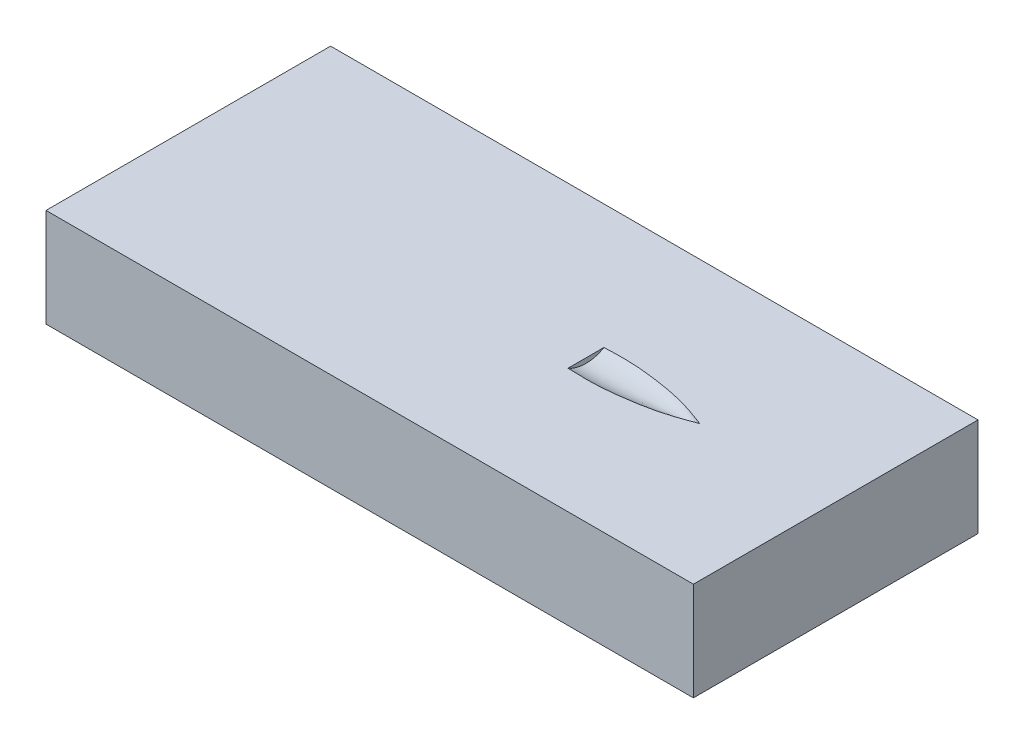
ISO-10303-21;
HEADER;
FILE_DESCRIPTION(('STEP AP214'),'2;1');
FILE_NAME('part.step','',(''),(''),'','','');
FILE_SCHEMA(('AUTOMOTIVE_DESIGN { 1 0 10303 214 1 1 1 1 }'));
ENDSEC;
DATA;
#1=APPLICATION_CONTEXT('core data for automotive mechanical design processes');
#2=APPLICATION_PROTOCOL_DEFINITION('international standard','automotive_design',2000,#1);
#3=PRODUCT_CONTEXT('',#1,'mechanical');
#4=PRODUCT('Part','Part','',(#3));
#5=PRODUCT_RELATED_PRODUCT_CATEGORY('part','',(#4));
#6=PRODUCT_DEFINITION_FORMATION('','',#4);
#7=PRODUCT_DEFINITION_CONTEXT('part definition',#1,'design');
#8=PRODUCT_DEFINITION('design','',#6,#7);
#9=PRODUCT_DEFINITION_SHAPE('','',#8);
#10=(LENGTH_UNIT() NAMED_UNIT(*) SI_UNIT(.MILLI.,.METRE.));
#11=(NAMED_UNIT(*) PLANE_ANGLE_UNIT() SI_UNIT($,.RADIAN.));
#12=(NAMED_UNIT(*) SI_UNIT($,.STERADIAN.) SOLID_ANGLE_UNIT());
#13=UNCERTAINTY_MEASURE_WITH_UNIT(LENGTH_MEASURE(1.E-05),#10,'distance_accuracy_value','');
#14=(GEOMETRIC_REPRESENTATION_CONTEXT(3) GLOBAL_UNCERTAINTY_ASSIGNED_CONTEXT((#13)) GLOBAL_UNIT_ASSIGNED_CONTEXT((#10,
#11,#12)) REPRESENTATION_CONTEXT('',''));
#15=CARTESIAN_POINT('',(0.,0.,0.));
#16=DIRECTION('',(0.,0.,1.));
#17=DIRECTION('',(1.,0.,0.));
#18=AXIS2_PLACEMENT_3D('',#15,#16,#17);
#19=CARTESIAN_POINT('',(-150.,-17.,81.405771285938));
#20=CARTESIAN_POINT('',(-116.638846737262,-17.6672118608523,80.8095738798847));
#21=CARTESIAN_POINT('',(-49.7427742053213,-19.0051108443265,79.6140736942468));
#22=CARTESIAN_POINT('',(50.6317027871444,-21.0127703181343,65.3499909791472));
#23=CARTESIAN_POINT('',(151.227954208533,-23.0240357792725,40.5691423295298));
#24=CARTESIAN_POINT('',(216.774855827415,-24.3366500190966,13.6494309993884));
#25=CARTESIAN_POINT('',(249.9,-25.,0.0451370225326122));
#26=CARTESIAN_POINT('',(-150.,-21.8051540860384,75.7963536954995));
#27=CARTESIAN_POINT('',(-116.638846737262,-22.5655101612967,75.3244737477681));
#28=CARTESIAN_POINT('',(-49.7427742053213,-24.0901827276193,74.3782560027998));
#29=CARTESIAN_POINT('',(50.6317027871444,-25.3526769380671,60.9130466986286));
#30=CARTESIAN_POINT('',(151.227954208533,-26.3707911350128,39.0705039634522));
#31=CARTESIAN_POINT('',(216.774855827415,-27.7472853242932,13.1463238474013));
#32=CARTESIAN_POINT('',(249.9,-28.4429180292189,0.0451370225326118));
#33=CARTESIAN_POINT('',(-150.,-30.4196988845977,63.7246782220816));
#34=CARTESIAN_POINT('',(-116.638846737262,-31.3659657699669,63.4502856806367));
#35=CARTESIAN_POINT('',(-49.7427742053213,-33.2634282977069,62.9000713876785));
#36=CARTESIAN_POINT('',(50.6317027871446,-33.106174464079,51.2985487065188));
#37=CARTESIAN_POINT('',(151.227954208533,-32.7893086977552,34.7857992726971));
#38=CARTESIAN_POINT('',(216.774855827415,-33.8681584780577,11.7060337279786));
#39=CARTESIAN_POINT('',(249.9,-34.4133719607769,0.0423159586243231));
#40=CARTESIAN_POINT('',(-150.,-39.9491696874336,43.6235895569039));
#41=CARTESIAN_POINT('',(-116.638846737262,-41.1292967625243,43.5175237114742));
#42=CARTESIAN_POINT('',(-49.7427742053211,-43.4956977616275,43.3048395625438));
#43=CARTESIAN_POINT('',(50.6317027871442,-41.6370640720175,35.1670631615842));
#44=CARTESIAN_POINT('',(151.227954208534,-40.5287833395358,25.1330207184538));
#45=CARTESIAN_POINT('',(216.774855827415,-40.6321518122783,8.45847664431594));
#46=CARTESIAN_POINT('',(249.9,-40.6843906744964,0.0317369689682422));
#47=CARTESIAN_POINT('',(-150.,-45.7889049113112,22.1583537592279));
#48=CARTESIAN_POINT('',(-116.638846737262,-47.1240890131779,22.1291663050477));
#49=CARTESIAN_POINT('',(-49.7427742053214,-49.8014117009921,22.0706393699479));
#50=CARTESIAN_POINT('',(50.6317027871445,-46.8411508509107,17.8763287205671));
#51=CARTESIAN_POINT('',(151.227954208534,-45.5486295254136,13.1697217970133));
#52=CARTESIAN_POINT('',(216.774855827415,-44.7405878200843,4.43244489076427));
#53=CARTESIAN_POINT('',(249.9,-44.3322314016204,0.0169263834497292));
#54=CARTESIAN_POINT('',(-150.,-47.7559083208649,0.));
#55=CARTESIAN_POINT('',(-116.638846737262,-49.1459003431606,0.));
#56=CARTESIAN_POINT('',(-49.7427742053212,-51.9331243461798,0.));
#57=CARTESIAN_POINT('',(50.6317027871444,-48.5824626978723,0.));
#58=CARTESIAN_POINT('',(151.227954208533,-47.3149233158318,0.));
#59=CARTESIAN_POINT('',(216.774855827415,-46.0550665245405,0.));
#60=CARTESIAN_POINT('',(249.9,-45.4183783391708,0.));
#61=CARTESIAN_POINT('',(-150.,-45.7889049113112,-22.1583537592281));
#62=CARTESIAN_POINT('',(-116.638846737262,-47.1259260630216,-22.1291663050479));
#63=CARTESIAN_POINT('',(-49.7427742053212,-49.8069324190415,-22.0706393699482));
#64=CARTESIAN_POINT('',(50.631702787144,-46.8188095609941,-17.8763287205673));
#65=CARTESIAN_POINT('',(151.227954208535,-45.6344294759758,-13.1697217970134));
#66=CARTESIAN_POINT('',(216.774855827415,-44.5515603869442,-4.43244489076432));
#67=CARTESIAN_POINT('',(249.9,-44.0043156841697,-0.0169263834497295));
#68=CARTESIAN_POINT('',(-150.,-39.9491696874333,-43.6235895569039));
#69=CARTESIAN_POINT('',(-116.638846737262,-41.13228196852,-43.5175237114741));
#70=CARTESIAN_POINT('',(-49.7427742053215,-43.5046689284581,-43.3048395625436));
#71=CARTESIAN_POINT('',(50.6317027871449,-41.6007594759027,-35.1670631615843));
#72=CARTESIAN_POINT('',(151.227954208532,-40.6682082591992,-25.1330207184536));
#73=CARTESIAN_POINT('',(216.774855827415,-40.3249822334255,-8.45847664431589));
#74=CARTESIAN_POINT('',(249.9,-40.1515276336391,-0.0317369689682436));
#75=CARTESIAN_POINT('',(-150.,-30.4196988845977,-63.7246782220818));
#76=CARTESIAN_POINT('',(-116.638846737262,-31.3687213447323,-63.4502856806368));
#77=CARTESIAN_POINT('',(-49.7427742053211,-33.2717093747809,-62.9000713876787));
#78=CARTESIAN_POINT('',(50.631702787144,-33.072662529204,-51.298548706519));
#79=CARTESIAN_POINT('',(151.227954208534,-32.9180086235985,-34.7857992726972));
#80=CARTESIAN_POINT('',(216.774855827415,-33.5846173283475,-11.7060337279786));
#81=CARTESIAN_POINT('',(249.9,-33.921498384601,-0.0423159586243264));
#82=CARTESIAN_POINT('',(-150.,-21.8051540860384,-75.7963536954995));
#83=CARTESIAN_POINT('',(-116.638846737262,-22.5667348611924,-75.3244737477681));
#84=CARTESIAN_POINT('',(-49.7427742053213,-24.0938632063189,-74.3782560027999));
#85=CARTESIAN_POINT('',(50.6317027871444,-25.3377827447892,-60.9130466986286));
#86=CARTESIAN_POINT('',(151.227954208533,-26.4279911020543,-39.0705039634522));
#87=CARTESIAN_POINT('',(216.774855827415,-27.6212670355331,-13.1463238474013));
#88=CARTESIAN_POINT('',(249.9,-28.2243075509185,-0.0451370225326169));
#89=CARTESIAN_POINT('',(-150.,-17.,-81.405771285938));
#90=CARTESIAN_POINT('',(-116.638846737262,-17.6672118608522,-80.8095738798847));
#91=CARTESIAN_POINT('',(-49.7427742053213,-19.0051108443264,-79.614073694247));
#92=CARTESIAN_POINT('',(50.6317027871444,-21.0127703181342,-65.3499909791472));
#93=CARTESIAN_POINT('',(151.227954208533,-23.0240357792725,-40.5691423295299));
#94=CARTESIAN_POINT('',(216.774855827415,-24.3366500190966,-13.6494309993884));
#95=CARTESIAN_POINT('',(249.9,-25.,-0.0451370225326184));
#96=B_SPLINE_SURFACE_WITH_KNOTS('',3,3,((#19,#20,#21,#22,#23,#24,#25),(#26,#27,#28,#29,#30,#31,
#32),(#33,#34,#35,#36,#37,#38,#39),(#40,#41,#42,#43,#44,#45,#46),(#47,#48,#49,#50,#51,#52,#53),
(#54,#55,#56,#57,#58,#59,#60),(#61,#62,#63,#64,#65,#66,#67),(#68,#69,#70,#71,#72,#73,#74),(#75,
#76,#77,#78,#79,#80,#81),(#82,#83,#84,#85,#86,#87,#88),(#89,#90,#91,#92,#93,#94,#95)),
.UNSPECIFIED.,.F.,.F.,.F.,(4,1,1,1,1,1,1,1,4),(4,1,1,1,4),(0.,0.125,0.25,0.375,0.5,0.625,0.75,
0.875,1.),(0.,0.246022042488694,0.493325523526259,0.743944188554489,1.),.UNSPECIFIED.);
#97=CARTESIAN_POINT('',(-150.,78.0310764729347,0.));
#98=DIRECTION('',(1.,0.,0.));
#99=DIRECTION('',(0.,0.,1.));
#100=AXIS2_PLACEMENT_3D('',#97,#98,#99);
#101=CIRCLE('',#100,125.131151574111);
#102=CARTESIAN_POINT('',(-150.,-30.000000000094,63.1438135401164));
#103=VERTEX_POINT('',#102);
#104=CARTESIAN_POINT('',(-150.,-29.9999999999909,-63.1438135404537));
#105=VERTEX_POINT('',#104);
#106=EDGE_CURVE('E171',#103,#105,#101,.T.);
#107=CARTESIAN_POINT('',(-150.,-30.000000000094,63.1438135401164));
#108=CARTESIAN_POINT('',(-148.303174488047,-30.0000000000338,63.2109087051731));
#109=CARTESIAN_POINT('',(-146.606322308969,-30.000000000009,63.277348864486));
#110=CARTESIAN_POINT('',(-143.212498847984,-29.999999999991,63.4082834233983));
#111=CARTESIAN_POINT('',(-141.515527564128,-29.9999999999976,63.4727777723948));
#112=CARTESIAN_POINT('',(-138.121462040788,-30.0000000000024,63.5991823874871));
#113=CARTESIAN_POINT('',(-136.424367799808,-30.0000000000006,63.6610926135786));
#114=CARTESIAN_POINT('',(-133.030053619916,-29.9999999999993,63.7817049716669));
#115=CARTESIAN_POINT('',(-131.332833680239,-29.9999999999998,63.8404070822541));
#116=CARTESIAN_POINT('',(-127.93826552419,-30.0000000000002,63.9539883800537));
#117=CARTESIAN_POINT('',(-126.240917307825,-30.,64.0088675674974));
#118=CARTESIAN_POINT('',(-122.846090393193,-30.,64.1141974889702));
#119=CARTESIAN_POINT('',(-121.14861169553,-30.,64.1646482423859));
#120=CARTESIAN_POINT('',(-117.753433092101,-30.,64.260526299464));
#121=CARTESIAN_POINT('',(-116.055733179729,-30.,64.3059533701372));
#122=CARTESIAN_POINT('',(-112.660197008215,-30.,64.3911906408751));
#123=CARTESIAN_POINT('',(-110.962360749514,-30.,64.4310008584292));
#124=CARTESIAN_POINT('',(-107.566547651452,-30.,64.5044202100621));
#125=CARTESIAN_POINT('',(-105.868570811633,-30.,64.538029323094));
#126=CARTESIAN_POINT('',(-102.472472627765,-30.,64.5984675228034));
#127=CARTESIAN_POINT('',(-100.774351282057,-30.,64.6252965168175));
#128=CARTESIAN_POINT('',(-97.3779594205936,-30.,64.6715998564886));
#129=CARTESIAN_POINT('',(-95.6796889019914,-30.,64.6910739961439));
#130=CARTESIAN_POINT('',(-92.2829971369807,-30.,64.722096698709));
#131=CARTESIAN_POINT('',(-90.5845758872372,-30.,64.7336448912877));
#132=CARTESIAN_POINT('',(-85.4777005511371,-30.,64.7555965747348));
#133=CARTESIAN_POINT('',(-82.0691790534721,-30.,64.7531418645007));
#134=CARTESIAN_POINT('',(-75.2521151613664,-30.,64.7094654784167));
#135=CARTESIAN_POINT('',(-71.8435727831338,-30.,64.6682410078079));
#136=CARTESIAN_POINT('',(-66.7313803213126,-30.,64.573938876537));
#137=CARTESIAN_POINT('',(-65.0274220727421,-30.,64.5370940029457));
#138=CARTESIAN_POINT('',(-61.619786899533,-30.,64.4520211481255));
#139=CARTESIAN_POINT('',(-59.9161099749199,-30.,64.4037931658663));
#140=CARTESIAN_POINT('',(-56.5091960956182,-30.,64.2953931343788));
#141=CARTESIAN_POINT('',(-54.8059591270966,-30.,64.2352215228313));
#142=CARTESIAN_POINT('',(-52.2514721688442,-30.,64.1355927523358));
#143=CARTESIAN_POINT('',(-51.4000375501818,-30.,64.1008212522839));
#144=CARTESIAN_POINT('',(-49.6973052302404,-30.,64.0280738154914));
#145=CARTESIAN_POINT('',(-48.8460075289687,-30.,63.9900978785816));
#146=CARTESIAN_POINT('',(-46.2923815641978,-30.,63.8714199545743));
#147=CARTESIAN_POINT('',(-44.5902716752403,-30.,63.7859659515517));
#148=CARTESIAN_POINT('',(-41.1867126235601,-30.,63.6028465417992));
#149=CARTESIAN_POINT('',(-39.4852634615501,-30.,63.5051811219336));
#150=CARTESIAN_POINT('',(-34.3821298354002,-30.,63.1945195524769));
#151=CARTESIAN_POINT('',(-30.981507247715,-30.,62.9638509521825));
#152=CARTESIAN_POINT('',(-24.1835172351267,-30.,62.4586964195533));
#153=CARTESIAN_POINT('',(-20.7861498378634,-30.,62.1842101184237));
#154=CARTESIAN_POINT('',(-13.9947932701885,-30.,61.5945509679733));
#155=CARTESIAN_POINT('',(-10.6008042682078,-30.,61.2793761833686));
#156=CARTESIAN_POINT('',(-3.81632360834457,-30.,60.6113582098535));
#157=CARTESIAN_POINT('',(-0.425832193290021,-30.,60.2585125627398));
#158=CARTESIAN_POINT('',(6.35153114557136,-30.,59.5180860243212));
#159=CARTESIAN_POINT('',(9.73840286456164,-30.,59.1305032628925));
#160=CARTESIAN_POINT('',(16.5083946786765,-30.,58.3234722531869));
#161=CARTESIAN_POINT('',(19.8915147109152,-30.,57.9040234787241));
#162=CARTESIAN_POINT('',(26.6538703401469,-30.,57.036077348936));
#163=CARTESIAN_POINT('',(30.0331061013356,-30.,56.5875812711835));
#164=CARTESIAN_POINT('',(35.4304408887764,-30.,55.8498060895503));
#165=CARTESIAN_POINT('',(37.4497022512696,-30.,55.5689881368893));
#166=CARTESIAN_POINT('',(41.4868479699227,-30.,54.9985166756687));
#167=CARTESIAN_POINT('',(43.5047324048297,-30.,54.7088637249445));
#168=CARTESIAN_POINT('',(46.5306102530659,-30.,54.2681598203254));
#169=CARTESIAN_POINT('',(47.5390586802216,-30.,54.1202240110798));
#170=CARTESIAN_POINT('',(49.5556611062366,-30.,53.8223589800068));
#171=CARTESIAN_POINT('',(50.5638151050935,-30.,53.672429758163));
#172=CARTESIAN_POINT('',(53.5877908081136,-30.,53.2196346994404));
#173=CARTESIAN_POINT('',(55.6031624935621,-30.,52.913756185464));
#174=CARTESIAN_POINT('',(59.6325741740228,-30.,52.2932666218014));
#175=CARTESIAN_POINT('',(61.6466141608582,-30.,51.9786555189959));
#176=CARTESIAN_POINT('',(65.6729067879237,-30.,51.3400965315165));
#177=CARTESIAN_POINT('',(67.6851596498867,-30.,51.0161500460558));
#178=CARTESIAN_POINT('',(71.7080514048187,-30.,50.358196349437));
#179=CARTESIAN_POINT('',(73.7186902736374,-30.,50.0241889905155));
#180=CARTESIAN_POINT('',(77.7381668563762,-30.,49.3454363570875));
#181=CARTESIAN_POINT('',(79.7470045608019,-30.,49.0006910263164));
#182=CARTESIAN_POINT('',(83.7626893900216,-30.,48.2997723911528));
#183=CARTESIAN_POINT('',(85.7695365121799,-30.,47.9435990716493));
#184=CARTESIAN_POINT('',(89.7810485265083,-30.,47.2191213481386));
#185=CARTESIAN_POINT('',(91.7857134111312,-30.,46.8508169023133));
#186=CARTESIAN_POINT('',(95.7941160974211,-30.,46.1010881665573));
#187=CARTESIAN_POINT('',(97.7978521325725,-30.,45.719654425564));
#188=CARTESIAN_POINT('',(101.802697049571,-30.,44.9431945431398));
#189=CARTESIAN_POINT('',(103.803805923334,-30.,44.5481683599839));
#190=CARTESIAN_POINT('',(107.803145334671,-30.,43.7437839979624));
#191=CARTESIAN_POINT('',(109.801375868994,-30.,43.3344258029281));
#192=CARTESIAN_POINT('',(113.794704394706,-30.,42.5006229113007));
#193=CARTESIAN_POINT('',(115.789802362787,-30.,42.0761781030077));
#194=CARTESIAN_POINT('',(119.776608410611,-30.,41.2114327356625));
#195=CARTESIAN_POINT('',(121.768316412801,-30.,40.7711318188397));
#196=CARTESIAN_POINT('',(125.748045075474,-30.,39.8738991782947));
#197=CARTESIAN_POINT('',(127.736065629517,-30.,39.4169669821186));
#198=CARTESIAN_POINT('',(131.708046624629,-30.,38.4857018283268));
#199=CARTESIAN_POINT('',(133.692007030315,-30.,38.0113687197462));
#200=CARTESIAN_POINT('',(137.655456690163,-30.,37.0445335916654));
#201=CARTESIAN_POINT('',(139.634946040606,-30.,36.5520319674526));
#202=CARTESIAN_POINT('',(142.600524170553,-30.,35.7990712610573));
#203=CARTESIAN_POINT('',(143.588422377687,-30.,35.5457212057149));
#204=CARTESIAN_POINT('',(145.562966713574,-30.,35.0341859320255));
#205=CARTESIAN_POINT('',(146.549612842859,-30.,34.7760007157349));
#206=CARTESIAN_POINT('',(148.521551720992,-30.,34.2547036606292));
#207=CARTESIAN_POINT('',(149.506844533085,-30.,33.991592061074));
#208=CARTESIAN_POINT('',(151.476080145986,-30.,33.4603625329659));
#209=CARTESIAN_POINT('',(152.460022945557,-30.,33.1922445998249));
#210=CARTESIAN_POINT('',(154.807480775352,-30.,32.5463276675969));
#211=CARTESIAN_POINT('',(156.17037665555,-30.,32.166276138256));
#212=CARTESIAN_POINT('',(158.893608246793,-30.,31.3971121746864));
#213=CARTESIAN_POINT('',(160.253943953489,-30.,31.0079997250848));
#214=CARTESIAN_POINT('',(164.331242264044,-30.,29.8275319124085));
#215=CARTESIAN_POINT('',(167.044419595573,-30.,29.0230671615297));
#216=CARTESIAN_POINT('',(172.461221488424,-30.,27.3817146686648));
#217=CARTESIAN_POINT('',(175.164845076496,-30.,26.5448237216978));
#218=CARTESIAN_POINT('',(180.563059597437,-30.,24.8412124982684));
#219=CARTESIAN_POINT('',(183.257649301219,-30.,23.9744883303101));
#220=CARTESIAN_POINT('',(188.638316276971,-30.,22.2138575544842));
#221=CARTESIAN_POINT('',(191.324392380644,-30.,21.3199473803461));
#222=CARTESIAN_POINT('',(196.688572656636,-30.,19.5076415764406));
#223=CARTESIAN_POINT('',(199.366675975254,-30.,18.589243422487));
#224=CARTESIAN_POINT('',(204.718629963381,-30.,16.7296099147426));
#225=CARTESIAN_POINT('',(207.392471335761,-30.,15.7883478328095));
#226=CARTESIAN_POINT('',(212.733287523653,-30.,13.8868419438205));
#227=CARTESIAN_POINT('',(215.40026256722,-30.,12.9265987766295));
#228=CARTESIAN_POINT('',(220.727936241924,-30.,10.9899796444893));
#229=CARTESIAN_POINT('',(223.38863566916,-30.,10.0136058672683));
#230=CARTESIAN_POINT('',(228.704363037846,-30.,8.04761288768313));
#231=CARTESIAN_POINT('',(231.359392248565,-30.,7.05799711382233));
#232=CARTESIAN_POINT('',(236.664393540274,-30.,5.06843851848005));
#233=CARTESIAN_POINT('',(239.314367188139,-30.,4.06849986921668));
#234=CARTESIAN_POINT('',(244.609889430148,-30.,2.06124101394102));
#235=CARTESIAN_POINT('',(247.255439637464,-30.,1.05392506601491));
#236=CARTESIAN_POINT('',(249.9,-30.,0.0440428964813235));
#237=B_SPLINE_CURVE_WITH_KNOTS('',3,(#107,#108,#109,#110,#111,#112,#113,#114,#115,#116,#117,
#118,#119,#120,#121,#122,#123,#124,#125,#126,#127,#128,#129,#130,#131,#132,#133,#134,#135,#136,
#137,#138,#139,#140,#141,#142,#143,#144,#145,#146,#147,#148,#149,#150,#151,#152,#153,#154,#155,
#156,#157,#158,#159,#160,#161,#162,#163,#164,#165,#166,#167,#168,#169,#170,#171,#172,#173,#174,
#175,#176,#177,#178,#179,#180,#181,#182,#183,#184,#185,#186,#187,#188,#189,#190,#191,#192,#193,
#194,#195,#196,#197,#198,#199,#200,#201,#202,#203,#204,#205,#206,#207,#208,#209,#210,#211,#212,
#213,#214,#215,#216,#217,#218,#219,#220,#221,#222,#223,#224,#225,#226,#227,#228,#229,#230,#231,
#232,#233,#234,#235,#236),.UNSPECIFIED.,.F.,.F.,(4,2,2,2,2,2,2,2,2,2,2,2,2,2,2,2,2,2,2,2,2,2,2,
2,2,2,2,2,2,2,2,2,2,2,2,2,2,2,2,2,2,2,2,2,2,2,2,2,2,2,2,2,2,2,2,2,2,2,2,2,2,2,2,2,4),(0.,
5.09445560444609,10.1890435814435,15.2837103972693,20.3784112086652,25.4731117118842,
30.5677899108129,35.6627042927385,40.7576028100066,45.8525186192425,50.9475040565552,
56.0426321884293,61.1379983683537,71.3633653164922,81.58946942743,86.7025071503557,
91.8155453361055,96.9283961863908,99.4848239039344,102.041251756476,107.153961060412,
112.266675864075,122.491649058579,132.716708316855,142.942254093364,153.168467543795,
163.395231868606,173.622165099063,183.84864882859,189.9647151615,196.080396126545,
199.138118981614,202.195841862067,208.311177650781,214.426550646513,220.541011771961,
226.655562743916,232.770145760201,238.884736862046,244.999349044169,251.118458842121,
257.237587425712,263.356722912813,269.475903714851,275.595222674152,281.714715604216,
287.83426163765,293.953674608226,297.01326616608,300.072856422672,303.132298467457,
306.191743316262,310.43638926004,314.681042405936,323.17058662244,331.660972090382,
340.152469287148,348.645085247693,357.1385800253,365.642533289389,374.146200366831,
382.648723443779,391.149086153615,399.646138203348,408.138621469009),.UNSPECIFIED.);
#238=CARTESIAN_POINT('',(249.9,-29.9999999948522,0.0440754122912198));
#239=VERTEX_POINT('',#238);
#240=EDGE_CURVE('E298',#103,#239,#237,.T.);
#241=CARTESIAN_POINT('',(249.9,-25.,0.0451370225326122));
#242=CARTESIAN_POINT('',(249.9,-28.4429180292189,0.0451370225326118));
#243=CARTESIAN_POINT('',(249.9,-34.4133719607769,0.0423159586243231));
#244=CARTESIAN_POINT('',(249.9,-40.6843906744964,0.0317369689682422));
#245=CARTESIAN_POINT('',(249.9,-44.3322314016204,0.0169263834497292));
#246=CARTESIAN_POINT('',(249.9,-45.4183783391708,0.));
#247=CARTESIAN_POINT('',(249.9,-44.0043156841697,-0.0169263834497295));
#248=CARTESIAN_POINT('',(249.9,-40.1515276336391,-0.0317369689682436));
#249=CARTESIAN_POINT('',(249.9,-33.921498384601,-0.0423159586243264));
#250=CARTESIAN_POINT('',(249.9,-28.2243075509185,-0.0451370225326169));
#251=CARTESIAN_POINT('',(249.9,-25.,-0.0451370225326184));
#252=B_SPLINE_CURVE_WITH_KNOTS('',3,(#241,#242,#243,#244,#245,#246,#247,#248,#249,#250,#251),
.UNSPECIFIED.,.F.,.F.,(4,1,1,1,1,1,1,1,4),(0.,0.125,0.25,0.375,0.5,0.625,0.75,0.875,1.),.UNSPECIFIED.);
#253=CARTESIAN_POINT('',(249.9,-29.9999999930648,-0.0439430814385722));
#254=VERTEX_POINT('',#253);
#255=EDGE_CURVE('E250',#239,#254,#252,.T.);
#256=CARTESIAN_POINT('',(249.9,-30.0000000000039,-0.0439039966229397));
#257=CARTESIAN_POINT('',(248.525003905595,-30.0000000000014,-0.566016888253522));
#258=CARTESIAN_POINT('',(247.149781355388,-30.0000000000004,-1.08753477787595));
#259=CARTESIAN_POINT('',(244.39874255809,-29.9999999999996,-2.12900047401064));
#260=CARTESIAN_POINT('',(243.022926311229,-29.9999999999999,-2.6489482811317));
#261=CARTESIAN_POINT('',(240.270559768479,-30.0000000000001,-3.68689357328367));
#262=CARTESIAN_POINT('',(238.894009473392,-30.,-4.20489106043884));
#263=CARTESIAN_POINT('',(236.139379192437,-30.,-5.23880195783158));
#264=CARTESIAN_POINT('',(234.761298790403,-30.,-5.75471425954916));
#265=CARTESIAN_POINT('',(232.004123088798,-30.,-6.78382636157928));
#266=CARTESIAN_POINT('',(230.625027787873,-30.,-7.29702615826424));
#267=CARTESIAN_POINT('',(227.865682586439,-30.,-8.32033334653465));
#268=CARTESIAN_POINT('',(226.485432680283,-30.,-8.83044072288993));
#269=CARTESIAN_POINT('',(223.032595316343,-30.,-10.1015879910296));
#270=CARTESIAN_POINT('',(220.959206162864,-30.,-10.8604525372619));
#271=CARTESIAN_POINT('',(216.809104001261,-30.,-12.3690608327822));
#272=CARTESIAN_POINT('',(214.732390983892,-30.,-13.118804556653));
#273=CARTESIAN_POINT('',(210.575235498536,-30.,-14.6078671272578));
#274=CARTESIAN_POINT('',(208.494793041981,-30.,-15.3471860058827));
#275=CARTESIAN_POINT('',(204.3297740137,-30.,-16.8140958865783));
#276=CARTESIAN_POINT('',(202.245197440376,-30.,-17.5416868841134));
#277=CARTESIAN_POINT('',(198.0724623665,-30.,-18.9835083680896));
#278=CARTESIAN_POINT('',(195.984305868316,-30.,-19.6977446456116));
#279=CARTESIAN_POINT('',(191.80312755306,-30.,-21.1118746062777));
#280=CARTESIAN_POINT('',(189.710105712348,-30.,-21.811768219567));
#281=CARTESIAN_POINT('',(185.518852866269,-30.,-23.1958946923459));
#282=CARTESIAN_POINT('',(183.420621787012,-30.,-23.8801273282702));
#283=CARTESIAN_POINT('',(179.218610265836,-30.,-25.2316137053305));
#284=CARTESIAN_POINT('',(177.114829618895,-30.,-25.8988668092012));
#285=CARTESIAN_POINT('',(172.190829235871,-30.,-27.4370410009175));
#286=CARTESIAN_POINT('',(169.368345573389,-30.,-28.3007306257715));
#287=CARTESIAN_POINT('',(163.712380502053,-30.,-29.992136667254));
#288=CARTESIAN_POINT('',(160.87889833194,-30.,-30.8198505436633));
#289=CARTESIAN_POINT('',(156.62028111908,-30.,-32.0319704494908));
#290=CARTESIAN_POINT('',(155.199328072636,-30.,-32.4311059745819));
#291=CARTESIAN_POINT('',(152.354585419883,-30.,-33.2191353354822));
#292=CARTESIAN_POINT('',(150.930795815755,-30.,-33.6080291791656));
#293=CARTESIAN_POINT('',(146.655158472134,-30.,-34.7588432522044));
#294=CARTESIAN_POINT('',(143.799026383986,-30.,-35.504900533718));
#295=CARTESIAN_POINT('',(138.076659476911,-30.,-36.9569840842948));
#296=CARTESIAN_POINT('',(135.210424756159,-30.,-37.6630107412317));
#297=CARTESIAN_POINT('',(129.469066999094,-30.,-39.0372307378007));
#298=CARTESIAN_POINT('',(126.593944439293,-30.,-39.7054260698549));
#299=CARTESIAN_POINT('',(120.832557546992,-30.,-41.0070267027425));
#300=CARTESIAN_POINT('',(117.946284493925,-30.,-41.6403933482423));
#301=CARTESIAN_POINT('',(112.16664184067,-30.,-42.8738695887667));
#302=CARTESIAN_POINT('',(109.273272220996,-30.,-43.4739790923716));
#303=CARTESIAN_POINT('',(103.480195344557,-30.,-44.6432866912031));
#304=CARTESIAN_POINT('',(100.580487866048,-30.,-45.2124836862861));
#305=CARTESIAN_POINT('',(94.7754897149422,-30.,-46.3222904418708));
#306=CARTESIAN_POINT('',(91.870198813586,-30.,-46.862899004034));
#307=CARTESIAN_POINT('',(86.0547834394392,-30.,-47.9178302561482));
#308=CARTESIAN_POINT('',(83.1446588520983,-30.,-48.4321523137051));
#309=CARTESIAN_POINT('',(77.3203234888844,-30.,-49.4367892824901));
#310=CARTESIAN_POINT('',(74.4061127776338,-30.,-49.9271045690788));
#311=CARTESIAN_POINT('',(68.1935650634764,-30.,-50.948590531326));
#312=CARTESIAN_POINT('',(64.8947317788405,-30.,-51.4767420735728));
#313=CARTESIAN_POINT('',(59.9437217914089,-30.,-52.2506021982707));
#314=CARTESIAN_POINT('',(58.292971363065,-30.,-52.505487497677));
#315=CARTESIAN_POINT('',(54.9905950993985,-30.,-53.0095302393482));
#316=CARTESIAN_POINT('',(53.3389692638509,-30.,-53.2586876801405));
#317=CARTESIAN_POINT('',(50.0349552835981,-30.,-53.7517520453726));
#318=CARTESIAN_POINT('',(48.3825671484476,-30.,-53.9956590338882));
#319=CARTESIAN_POINT('',(45.077013576005,-30.,-54.4781473147619));
#320=CARTESIAN_POINT('',(43.4238481388958,-30.,-54.716728608373));
#321=CARTESIAN_POINT('',(40.1166662350948,-30.,-55.1882124839506));
#322=CARTESIAN_POINT('',(38.4626497488052,-30.,-55.4211149285671));
#323=CARTESIAN_POINT('',(35.1537857994906,-30.,-55.8809343515646));
#324=CARTESIAN_POINT('',(33.4989383364633,-30.,-56.1078513299304));
#325=CARTESIAN_POINT('',(28.5328768809106,-30.,-56.7791726304867));
#326=CARTESIAN_POINT('',(25.2203764671111,-30.,-57.2141140612297));
#327=CARTESIAN_POINT('',(18.5947272930632,-30.,-58.0557718376539));
#328=CARTESIAN_POINT('',(15.2815816254934,-30.,-58.4625125014017));
#329=CARTESIAN_POINT('',(8.65165552198158,-30.,-59.2454928249023));
#330=CARTESIAN_POINT('',(5.3348750610144,-30.,-59.621732273303));
#331=CARTESIAN_POINT('',(-1.30210586656756,-30.,-60.3409215242471));
#332=CARTESIAN_POINT('',(-4.6223061221263,-30.,-60.6838732697592));
#333=CARTESIAN_POINT('',(-11.2659212119177,-30.,-61.3336401098729));
#334=CARTESIAN_POINT('',(-14.5893356962466,-30.,-61.6404587704356));
#335=CARTESIAN_POINT('',(-21.239174895461,-30.,-62.2150363711028));
#336=CARTESIAN_POINT('',(-24.5655992348615,-30.,-62.482799647235));
#337=CARTESIAN_POINT('',(-31.2739618877537,-30.,-62.9801520170514));
#338=CARTESIAN_POINT('',(-34.6559500983379,-30.,-63.2090741205794));
#339=CARTESIAN_POINT('',(-39.731093432748,-30.,-63.5174013021972));
#340=CARTESIAN_POINT('',(-41.4231974917082,-30.,-63.6143357479775));
#341=CARTESIAN_POINT('',(-44.808060071684,-30.,-63.7960847979629));
#342=CARTESIAN_POINT('',(-46.5008185919772,-30.,-63.8808994155075));
#343=CARTESIAN_POINT('',(-49.0404538569022,-30.,-63.9986802452971));
#344=CARTESIAN_POINT('',(-49.8871140701547,-30.,-64.0363682596446));
#345=CARTESIAN_POINT('',(-51.5805699321534,-30.,-64.1085679675403));
#346=CARTESIAN_POINT('',(-52.4273655808941,-30.,-64.1430796612179));
#347=CARTESIAN_POINT('',(-54.967933615967,-30.,-64.2419722211293));
#348=CARTESIAN_POINT('',(-56.6618885663371,-30.,-64.3017106344661));
#349=CARTESIAN_POINT('',(-60.0504115693031,-30.,-64.4093562968381));
#350=CARTESIAN_POINT('',(-61.7449796747166,-30.,-64.4572618723058));
#351=CARTESIAN_POINT('',(-65.1343944706653,-30.,-64.541786694431));
#352=CARTESIAN_POINT('',(-66.829241161189,-30.,-64.5784059415537));
#353=CARTESIAN_POINT('',(-71.9146465569205,-30.,-64.672174929291));
#354=CARTESIAN_POINT('',(-75.3055116213773,-30.,-64.7132185259106));
#355=CARTESIAN_POINT('',(-82.087962783941,-30.,-64.7568214427822));
#356=CARTESIAN_POINT('',(-85.4795489144517,-30.,-64.759375061611));
#357=CARTESIAN_POINT('',(-92.2699562204608,-30.,-64.7304467836814));
#358=CARTESIAN_POINT('',(-95.6687770539562,-30.,-64.6988906943753));
#359=CARTESIAN_POINT('',(-102.465986947028,-30.,-64.6061972679687));
#360=CARTESIAN_POINT('',(-105.864376008349,-30.,-64.545060054407));
#361=CARTESIAN_POINT('',(-112.660214324403,-30.,-64.3978473891579));
#362=CARTESIAN_POINT('',(-116.057663642141,-30.0000000000001,-64.3117747860953));
#363=CARTESIAN_POINT('',(-122.851116656198,-29.9999999999999,-64.1194363559251));
#364=CARTESIAN_POINT('',(-126.247120500403,-29.9999999999998,-64.0131756715953));
#365=CARTESIAN_POINT('',(-133.03717663755,-30.0000000000002,-63.7853154223741));
#366=CARTESIAN_POINT('',(-136.43122915122,-30.0000000000009,-63.6637223163256));
#367=CARTESIAN_POINT('',(-143.216894924073,-29.9999999999991,-63.4102459076328));
#368=CARTESIAN_POINT('',(-146.608508416077,-29.9999999999967,-63.2783688789415));
#369=CARTESIAN_POINT('',(-150.,-29.9999999999909,-63.1438135404537));
#370=B_SPLINE_CURVE_WITH_KNOTS('',3,(#256,#257,#258,#259,#260,#261,#262,#263,#264,#265,#266,
#267,#268,#269,#270,#271,#272,#273,#274,#275,#276,#277,#278,#279,#280,#281,#282,#283,#284,#285,
#286,#287,#288,#289,#290,#291,#292,#293,#294,#295,#296,#297,#298,#299,#300,#301,#302,#303,#304,
#305,#306,#307,#308,#309,#310,#311,#312,#313,#314,#315,#316,#317,#318,#319,#320,#321,#322,#323,
#324,#325,#326,#327,#328,#329,#330,#331,#332,#333,#334,#335,#336,#337,#338,#339,#340,#341,#342,
#343,#344,#345,#346,#347,#348,#349,#350,#351,#352,#353,#354,#355,#356,#357,#358,#359,#360,#361,
#362,#363,#364,#365,#366,#367,#368,#369),.UNSPECIFIED.,.F.,.F.,(4,2,2,2,2,2,2,2,2,2,2,2,2,2,2,2,
2,2,2,2,2,2,2,2,2,2,2,2,2,2,2,2,2,2,2,2,2,2,2,2,2,2,2,2,2,2,2,2,2,2,2,2,2,2,2,2,4),(0.,
4.412363367062,8.82472502304393,13.2370818717834,17.6515375189382,22.065999068317,
26.4804823412999,33.1041602246723,39.7278565621495,46.3515326325323,52.9752112644352,
59.5959477075333,66.2167163887623,72.8375795246334,79.4586907852569,88.3134904065683,
97.1689142459761,101.5967192653,106.024520880185,114.880074771367,123.735542842639,
132.590544097749,141.45518272327,150.319845715381,159.184823985091,168.050173553182,
176.915736301363,185.781160386774,195.803580296268,200.81450974045,205.825440472916,
210.836310017908,215.847178383944,220.858167824014,225.869157276794,235.891841195637,
245.905772009353,255.919772206675,265.933187545238,275.945613833831,285.956927670002,
296.125774647878,301.210374981812,306.294969719445,308.837460494965,311.379951166821,
316.464928080351,321.550623771989,326.636319253914,336.809387796693,346.983963235617,
357.180714165087,367.37742251054,377.572966440622,387.765916598674,397.954587191798,
408.137089853594),.UNSPECIFIED.);
#371=EDGE_CURVE('E192',#254,#105,#370,.T.);
#372=ORIENTED_EDGE('',*,*,#106,.F.);
#373=ORIENTED_EDGE('',*,*,#240,.T.);
#374=ORIENTED_EDGE('',*,*,#255,.T.);
#375=ORIENTED_EDGE('',*,*,#371,.T.);
#376=EDGE_LOOP('',(#372,#373,#374,#375));
#377=FACE_BOUND('',#376,.T.);
#378=ADVANCED_FACE('F167',(#377),#96,.F.);
#379=CARTESIAN_POINT('',(-150.,78.0310764729347,0.));
#380=DIRECTION('',(1.,0.,0.));
#381=DIRECTION('',(0.,0.,-1.));
#382=AXIS2_PLACEMENT_3D('',#379,#380,#381);
#383=PLANE('',#382);
#384=DIRECTION('',(0.,0.,-1.));
#385=VECTOR('',#384,1.);
#386=CARTESIAN_POINT('',(-150.,-30.,0.));
#387=LINE('',#386,#385);
#388=EDGE_CURVE('E299',#103,#105,#387,.T.);
#389=ORIENTED_EDGE('',*,*,#388,.F.);
#390=ORIENTED_EDGE('',*,*,#106,.T.);
#391=EDGE_LOOP('',(#389,#390));
#392=FACE_BOUND('',#391,.T.);
#393=ADVANCED_FACE('F272',(#392),#383,.T.);
#394=CARTESIAN_POINT('',(249.9,-45.0016767404122,0.));
#395=DIRECTION('',(-1.,0.,0.));
#396=DIRECTION('',(0.,0.,1.));
#397=AXIS2_PLACEMENT_3D('',#394,#395,#396);
#398=PLANE('',#397);
#399=DIRECTION('',(0.,0.,1.));
#400=VECTOR('',#399,1.);
#401=CARTESIAN_POINT('',(249.9,-30.,0.));
#402=LINE('',#401,#400);
#403=EDGE_CURVE('E12',#254,#239,#402,.T.);
#404=ORIENTED_EDGE('',*,*,#403,.F.);
#405=ORIENTED_EDGE('',*,*,#255,.F.);
#406=EDGE_LOOP('',(#404,#405));
#407=FACE_BOUND('',#406,.T.);
#408=ADVANCED_FACE('F331',(#407),#398,.T.);
#409=CARTESIAN_POINT('',(0.,-30.,0.));
#410=DIRECTION('',(0.,-1.,0.));
#411=DIRECTION('',(0.,0.,-1.));
#412=AXIS2_PLACEMENT_3D('',#409,#410,#411);
#413=PLANE('',#412);
#414=ORIENTED_EDGE('',*,*,#388,.T.);
#415=ORIENTED_EDGE('',*,*,#371,.F.);
#416=ORIENTED_EDGE('',*,*,#403,.T.);
#417=ORIENTED_EDGE('',*,*,#240,.F.);
#418=EDGE_LOOP('',(#414,#415,#416,#417));
#419=FACE_BOUND('',#418,.T.);
#420=DIRECTION('',(0.,0.,-1.));
#421=VECTOR('',#420,1.);
#422=CARTESIAN_POINT('',(727.41253381631,-30.,499.914395568591));
#423=LINE('',#422,#421);
#424=CARTESIAN_POINT('',(727.41253381631,-30.,499.914395568591));
#425=VERTEX_POINT('',#424);
#426=CARTESIAN_POINT('',(727.41253381631,-30.,-499.914395568591));
#427=VERTEX_POINT('',#426);
#428=EDGE_CURVE('E220',#425,#427,#423,.T.);
#429=ORIENTED_EDGE('',*,*,#428,.T.);
#430=DIRECTION('',(-1.,0.,0.));
#431=VECTOR('',#430,1.);
#432=CARTESIAN_POINT('',(-1547.22390460987,-30.,-499.914395568591));
#433=LINE('',#432,#431);
#434=CARTESIAN_POINT('',(-1547.22390460987,-30.,-499.914395568591));
#435=VERTEX_POINT('',#434);
#436=EDGE_CURVE('E223',#427,#435,#433,.T.);
#437=ORIENTED_EDGE('',*,*,#436,.T.);
#438=DIRECTION('',(0.,0.,1.));
#439=VECTOR('',#438,1.);
#440=CARTESIAN_POINT('',(-1547.22390460987,-30.,499.914395568591));
#441=LINE('',#440,#439);
#442=CARTESIAN_POINT('',(-1547.22390460987,-30.,499.914395568591));
#443=VERTEX_POINT('',#442);
#444=EDGE_CURVE('E185',#435,#443,#441,.T.);
#445=ORIENTED_EDGE('',*,*,#444,.T.);
#446=DIRECTION('',(1.,0.,0.));
#447=VECTOR('',#446,1.);
#448=CARTESIAN_POINT('',(-1547.22390460987,-30.,499.914395568591));
#449=LINE('',#448,#447);
#450=EDGE_CURVE('E224',#443,#425,#449,.T.);
#451=ORIENTED_EDGE('',*,*,#450,.T.);
#452=EDGE_LOOP('',(#429,#437,#445,#451));
#453=FACE_BOUND('',#452,.T.);
#454=ADVANCED_FACE('F222',(#419,#453),#413,.F.);
#455=CARTESIAN_POINT('',(727.41253381631,213.,499.914395568591));
#456=DIRECTION('',(-1.,0.,0.));
#457=DIRECTION('',(0.,0.,1.));
#458=AXIS2_PLACEMENT_3D('',#455,#456,#457);
#459=PLANE('',#458);
#460=DIRECTION('',(0.,-1.,0.));
#461=VECTOR('',#460,1.);
#462=CARTESIAN_POINT('',(727.41253381631,213.,-499.914395568591));
#463=LINE('',#462,#461);
#464=CARTESIAN_POINT('',(727.41253381631,-376.,-499.914395568591));
#465=VERTEX_POINT('',#464);
#466=EDGE_CURVE('E177',#427,#465,#463,.T.);
#467=ORIENTED_EDGE('',*,*,#466,.F.);
#468=ORIENTED_EDGE('',*,*,#428,.F.);
#469=DIRECTION('',(0.,-1.,0.));
#470=VECTOR('',#469,1.);
#471=CARTESIAN_POINT('',(727.41253381631,213.,499.914395568591));
#472=LINE('',#471,#470);
#473=CARTESIAN_POINT('',(727.41253381631,-376.,499.914395568591));
#474=VERTEX_POINT('',#473);
#475=EDGE_CURVE('E410',#425,#474,#472,.T.);
#476=ORIENTED_EDGE('',*,*,#475,.T.);
#477=DIRECTION('',(0.,0.,-1.));
#478=VECTOR('',#477,1.);
#479=CARTESIAN_POINT('',(727.41253381631,-376.,499.914395568591));
#480=LINE('',#479,#478);
#481=EDGE_CURVE('E238',#474,#465,#480,.T.);
#482=ORIENTED_EDGE('',*,*,#481,.T.);
#483=EDGE_LOOP('',(#467,#468,#476,#482));
#484=FACE_BOUND('',#483,.T.);
#485=ADVANCED_FACE('F169',(#484),#459,.F.);
#486=CARTESIAN_POINT('',(-1547.22390460987,213.,-499.914395568591));
#487=DIRECTION('',(0.,0.,1.));
#488=DIRECTION('',(1.,0.,0.));
#489=AXIS2_PLACEMENT_3D('',#486,#487,#488);
#490=PLANE('',#489);
#491=DIRECTION('',(0.,-1.,0.));
#492=VECTOR('',#491,1.);
#493=CARTESIAN_POINT('',(-1547.22390460987,213.,-499.914395568591));
#494=LINE('',#493,#492);
#495=CARTESIAN_POINT('',(-1547.22390460987,-376.,-499.914395568591));
#496=VERTEX_POINT('',#495);
#497=EDGE_CURVE('E234',#435,#496,#494,.T.);
#498=ORIENTED_EDGE('',*,*,#497,.F.);
#499=ORIENTED_EDGE('',*,*,#436,.F.);
#500=ORIENTED_EDGE('',*,*,#466,.T.);
#501=DIRECTION('',(-1.,0.,0.));
#502=VECTOR('',#501,1.);
#503=CARTESIAN_POINT('',(-1547.22390460987,-376.,-499.914395568591));
#504=LINE('',#503,#502);
#505=EDGE_CURVE('E415',#465,#496,#504,.T.);
#506=ORIENTED_EDGE('',*,*,#505,.T.);
#507=EDGE_LOOP('',(#498,#499,#500,#506));
#508=FACE_BOUND('',#507,.T.);
#509=ADVANCED_FACE('F231',(#508),#490,.F.);
#510=CARTESIAN_POINT('',(-1547.22390460987,213.,499.914395568591));
#511=DIRECTION('',(1.,0.,0.));
#512=DIRECTION('',(0.,0.,-1.));
#513=AXIS2_PLACEMENT_3D('',#510,#511,#512);
#514=PLANE('',#513);
#515=DIRECTION('',(0.,-1.,0.));
#516=VECTOR('',#515,1.);
#517=CARTESIAN_POINT('',(-1547.22390460987,213.,499.914395568591));
#518=LINE('',#517,#516);
#519=CARTESIAN_POINT('',(-1547.22390460987,-376.,499.914395568591));
#520=VERTEX_POINT('',#519);
#521=EDGE_CURVE('E240',#443,#520,#518,.T.);
#522=ORIENTED_EDGE('',*,*,#521,.F.);
#523=ORIENTED_EDGE('',*,*,#444,.F.);
#524=ORIENTED_EDGE('',*,*,#497,.T.);
#525=DIRECTION('',(0.,0.,1.));
#526=VECTOR('',#525,1.);
#527=CARTESIAN_POINT('',(-1547.22390460987,-376.,499.914395568591));
#528=LINE('',#527,#526);
#529=EDGE_CURVE('E407',#496,#520,#528,.T.);
#530=ORIENTED_EDGE('',*,*,#529,.T.);
#531=EDGE_LOOP('',(#522,#523,#524,#530));
#532=FACE_BOUND('',#531,.T.);
#533=ADVANCED_FACE('F349',(#532),#514,.F.);
#534=CARTESIAN_POINT('',(-1547.22390460987,213.,499.914395568591));
#535=DIRECTION('',(0.,0.,-1.));
#536=DIRECTION('',(-1.,0.,0.));
#537=AXIS2_PLACEMENT_3D('',#534,#535,#536);
#538=PLANE('',#537);
#539=ORIENTED_EDGE('',*,*,#475,.F.);
#540=ORIENTED_EDGE('',*,*,#450,.F.);
#541=ORIENTED_EDGE('',*,*,#521,.T.);
#542=DIRECTION('',(1.,0.,0.));
#543=VECTOR('',#542,1.);
#544=CARTESIAN_POINT('',(-1547.22390460987,-376.,499.914395568591));
#545=LINE('',#544,#543);
#546=EDGE_CURVE('E411',#520,#474,#545,.T.);
#547=ORIENTED_EDGE('',*,*,#546,.T.);
#548=EDGE_LOOP('',(#539,#540,#541,#547));
#549=FACE_BOUND('',#548,.T.);
#550=ADVANCED_FACE('F345',(#549),#538,.F.);
#551=CARTESIAN_POINT('',(0.,-376.,0.));
#552=DIRECTION('',(0.,-1.,0.));
#553=DIRECTION('',(0.,0.,-1.));
#554=AXIS2_PLACEMENT_3D('',#551,#552,#553);
#555=PLANE('',#554);
#556=ORIENTED_EDGE('',*,*,#481,.F.);
#557=ORIENTED_EDGE('',*,*,#546,.F.);
#558=ORIENTED_EDGE('',*,*,#529,.F.);
#559=ORIENTED_EDGE('',*,*,#505,.F.);
#560=EDGE_LOOP('',(#556,#557,#558,#559));
#561=FACE_BOUND('',#560,.T.);
#562=ADVANCED_FACE('F342',(#561),#555,.T.);
#563=CLOSED_SHELL('',(#378,#393,#408,#454,#485,#509,#533,#550,#562));
#564=MANIFOLD_SOLID_BREP('B2',#563);
#565=ADVANCED_BREP_SHAPE_REPRESENTATION('',(#18,#564),#14);
#566=SHAPE_DEFINITION_REPRESENTATION(#9,#565);
ENDSEC;
END-ISO-10303-21;
